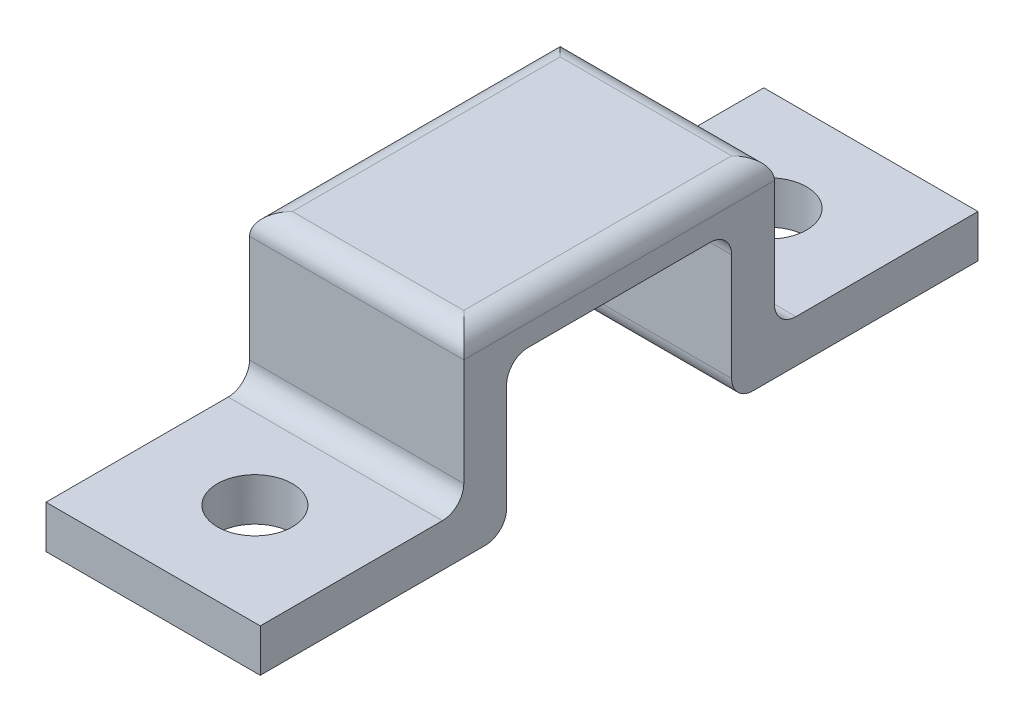
ISO-10303-21;
HEADER;
FILE_DESCRIPTION(('STEP AP214'),'2;1');
FILE_NAME('part.step','',(''),(''),'','','');
FILE_SCHEMA(('AUTOMOTIVE_DESIGN { 1 0 10303 214 1 1 1 1 }'));
ENDSEC;
DATA;
#1=APPLICATION_CONTEXT('core data for automotive mechanical design processes');
#2=APPLICATION_PROTOCOL_DEFINITION('international standard','automotive_design',2000,#1);
#3=PRODUCT_CONTEXT('',#1,'mechanical');
#4=PRODUCT('Part','Part','',(#3));
#5=PRODUCT_RELATED_PRODUCT_CATEGORY('part','',(#4));
#6=PRODUCT_DEFINITION_FORMATION('','',#4);
#7=PRODUCT_DEFINITION_CONTEXT('part definition',#1,'design');
#8=PRODUCT_DEFINITION('design','',#6,#7);
#9=PRODUCT_DEFINITION_SHAPE('','',#8);
#10=(LENGTH_UNIT() NAMED_UNIT(*) SI_UNIT(.MILLI.,.METRE.));
#11=(NAMED_UNIT(*) PLANE_ANGLE_UNIT() SI_UNIT($,.RADIAN.));
#12=(NAMED_UNIT(*) SI_UNIT($,.STERADIAN.) SOLID_ANGLE_UNIT());
#13=UNCERTAINTY_MEASURE_WITH_UNIT(LENGTH_MEASURE(1.E-05),#10,'distance_accuracy_value','');
#14=(GEOMETRIC_REPRESENTATION_CONTEXT(3) GLOBAL_UNCERTAINTY_ASSIGNED_CONTEXT((#13)) GLOBAL_UNIT_ASSIGNED_CONTEXT((#10,
#11,#12)) REPRESENTATION_CONTEXT('',''));
#15=CARTESIAN_POINT('',(0.,0.,0.));
#16=DIRECTION('',(0.,0.,1.));
#17=DIRECTION('',(1.,0.,0.));
#18=AXIS2_PLACEMENT_3D('',#15,#16,#17);
#19=CARTESIAN_POINT('',(20.,0.,10.5));
#20=DIRECTION('',(0.,0.,1.));
#21=DIRECTION('',(1.,0.,0.));
#22=AXIS2_PLACEMENT_3D('',#19,#20,#21);
#23=PLANE('',#22);
#24=DIRECTION('',(0.,1.,0.));
#25=VECTOR('',#24,1.);
#26=CARTESIAN_POINT('',(20.,0.,10.5));
#27=LINE('',#26,#25);
#28=CARTESIAN_POINT('',(20.,-12.,10.5));
#29=VERTEX_POINT('',#28);
#30=CARTESIAN_POINT('',(20.,-2.,10.5));
#31=VERTEX_POINT('',#30);
#32=EDGE_CURVE('E249',#29,#31,#27,.T.);
#33=ORIENTED_EDGE('',*,*,#32,.F.);
#34=DIRECTION('',(-1.,0.,0.));
#35=VECTOR('',#34,1.);
#36=CARTESIAN_POINT('',(20.,-12.,10.5));
#37=LINE('',#36,#35);
#38=CARTESIAN_POINT('',(0.,-12.,10.5));
#39=VERTEX_POINT('',#38);
#40=EDGE_CURVE('E279',#29,#39,#37,.T.);
#41=ORIENTED_EDGE('',*,*,#40,.T.);
#42=DIRECTION('',(0.,1.,0.));
#43=VECTOR('',#42,1.);
#44=CARTESIAN_POINT('',(0.,0.,10.5));
#45=LINE('',#44,#43);
#46=CARTESIAN_POINT('',(0.,-2.,10.5));
#47=VERTEX_POINT('',#46);
#48=EDGE_CURVE('E221',#39,#47,#45,.T.);
#49=ORIENTED_EDGE('',*,*,#48,.T.);
#50=DIRECTION('',(-1.,0.,0.));
#51=VECTOR('',#50,1.);
#52=CARTESIAN_POINT('',(20.,-2.,10.5));
#53=LINE('',#52,#51);
#54=EDGE_CURVE('E277',#47,#31,#53,.F.);
#55=ORIENTED_EDGE('',*,*,#54,.T.);
#56=EDGE_LOOP('',(#33,#41,#49,#55));
#57=FACE_BOUND('',#56,.T.);
#58=ADVANCED_FACE('F37',(#57),#23,.F.);
#59=CARTESIAN_POINT('',(20.,0.,10.5));
#60=DIRECTION('',(0.,1.,0.));
#61=DIRECTION('',(0.,0.,1.));
#62=AXIS2_PLACEMENT_3D('',#59,#60,#61);
#63=PLANE('',#62);
#64=DIRECTION('',(0.,0.,-1.));
#65=VECTOR('',#64,1.);
#66=CARTESIAN_POINT('',(20.,0.,10.5));
#67=LINE('',#66,#65);
#68=CARTESIAN_POINT('',(20.,0.,8.5));
#69=VERTEX_POINT('',#68);
#70=CARTESIAN_POINT('',(20.,0.,-8.49999999999999));
#71=VERTEX_POINT('',#70);
#72=EDGE_CURVE('E351',#69,#71,#67,.T.);
#73=ORIENTED_EDGE('',*,*,#72,.F.);
#74=DIRECTION('',(-1.,0.,0.));
#75=VECTOR('',#74,1.);
#76=CARTESIAN_POINT('',(0.,0.,8.5));
#77=LINE('',#76,#75);
#78=CARTESIAN_POINT('',(0.,0.,8.5));
#79=VERTEX_POINT('',#78);
#80=EDGE_CURVE('E307',#69,#79,#77,.T.);
#81=ORIENTED_EDGE('',*,*,#80,.T.);
#82=DIRECTION('',(0.,0.,-1.));
#83=VECTOR('',#82,1.);
#84=CARTESIAN_POINT('',(0.,0.,10.5));
#85=LINE('',#84,#83);
#86=CARTESIAN_POINT('',(0.,0.,-8.49999999999999));
#87=VERTEX_POINT('',#86);
#88=EDGE_CURVE('E224',#79,#87,#85,.T.);
#89=ORIENTED_EDGE('',*,*,#88,.T.);
#90=DIRECTION('',(-1.,0.,0.));
#91=VECTOR('',#90,1.);
#92=CARTESIAN_POINT('',(20.,0.,-8.5));
#93=LINE('',#92,#91);
#94=EDGE_CURVE('E305',#87,#71,#93,.F.);
#95=ORIENTED_EDGE('',*,*,#94,.T.);
#96=EDGE_LOOP('',(#73,#81,#89,#95));
#97=FACE_BOUND('',#96,.T.);
#98=ADVANCED_FACE('F414',(#97),#63,.F.);
#99=CARTESIAN_POINT('',(20.,0.,-10.5));
#100=DIRECTION('',(0.,0.,-1.));
#101=DIRECTION('',(-1.,0.,0.));
#102=AXIS2_PLACEMENT_3D('',#99,#100,#101);
#103=PLANE('',#102);
#104=DIRECTION('',(0.,-1.,0.));
#105=VECTOR('',#104,1.);
#106=CARTESIAN_POINT('',(0.,0.,-10.5));
#107=LINE('',#106,#105);
#108=CARTESIAN_POINT('',(0.,-2.,-10.5));
#109=VERTEX_POINT('',#108);
#110=CARTESIAN_POINT('',(0.,-12.,-10.5));
#111=VERTEX_POINT('',#110);
#112=EDGE_CURVE('E227',#109,#111,#107,.T.);
#113=ORIENTED_EDGE('',*,*,#112,.T.);
#114=DIRECTION('',(-1.,0.,0.));
#115=VECTOR('',#114,1.);
#116=CARTESIAN_POINT('',(20.,-12.,-10.5));
#117=LINE('',#116,#115);
#118=CARTESIAN_POINT('',(20.,-12.,-10.5));
#119=VERTEX_POINT('',#118);
#120=EDGE_CURVE('E289',#111,#119,#117,.F.);
#121=ORIENTED_EDGE('',*,*,#120,.T.);
#122=DIRECTION('',(0.,-1.,0.));
#123=VECTOR('',#122,1.);
#124=CARTESIAN_POINT('',(20.,0.,-10.5));
#125=LINE('',#124,#123);
#126=CARTESIAN_POINT('',(20.,-2.,-10.5));
#127=VERTEX_POINT('',#126);
#128=EDGE_CURVE('E189',#127,#119,#125,.T.);
#129=ORIENTED_EDGE('',*,*,#128,.F.);
#130=DIRECTION('',(-1.,0.,0.));
#131=VECTOR('',#130,1.);
#132=CARTESIAN_POINT('',(0.,-2.,-10.5));
#133=LINE('',#132,#131);
#134=EDGE_CURVE('E286',#127,#109,#133,.T.);
#135=ORIENTED_EDGE('',*,*,#134,.T.);
#136=EDGE_LOOP('',(#113,#121,#129,#135));
#137=FACE_BOUND('',#136,.T.);
#138=ADVANCED_FACE('F416',(#137),#103,.F.);
#139=CARTESIAN_POINT('',(20.,-14.,-10.5));
#140=DIRECTION('',(0.,1.,0.));
#141=DIRECTION('',(0.,0.,1.));
#142=AXIS2_PLACEMENT_3D('',#139,#140,#141);
#143=PLANE('',#142);
#144=CARTESIAN_POINT('',(10.,-14.,-24.));
#145=DIRECTION('',(0.,1.,0.));
#146=DIRECTION('',(0.,0.,1.));
#147=AXIS2_PLACEMENT_3D('',#144,#145,#146);
#148=CIRCLE('',#147,3.5);
#149=CARTESIAN_POINT('',(10.,-14.,-20.5));
#150=VERTEX_POINT('',#149);
#151=EDGE_CURVE('E225',#150,#150,#148,.F.);
#152=ORIENTED_EDGE('',*,*,#151,.F.);
#153=EDGE_LOOP('',(#152));
#154=FACE_BOUND('',#153,.T.);
#155=DIRECTION('',(0.,0.,-1.));
#156=VECTOR('',#155,1.);
#157=CARTESIAN_POINT('',(20.,-14.,-10.5));
#158=LINE('',#157,#156);
#159=CARTESIAN_POINT('',(20.,-14.,-12.5));
#160=VERTEX_POINT('',#159);
#161=CARTESIAN_POINT('',(20.,-14.,-33.5));
#162=VERTEX_POINT('',#161);
#163=EDGE_CURVE('E175',#160,#162,#158,.T.);
#164=ORIENTED_EDGE('',*,*,#163,.F.);
#165=DIRECTION('',(-1.,0.,0.));
#166=VECTOR('',#165,1.);
#167=CARTESIAN_POINT('',(20.,-14.,-12.5));
#168=LINE('',#167,#166);
#169=CARTESIAN_POINT('',(0.,-14.,-12.5));
#170=VERTEX_POINT('',#169);
#171=EDGE_CURVE('E284',#160,#170,#168,.T.);
#172=ORIENTED_EDGE('',*,*,#171,.T.);
#173=DIRECTION('',(0.,0.,-1.));
#174=VECTOR('',#173,1.);
#175=CARTESIAN_POINT('',(0.,-14.,-10.5));
#176=LINE('',#175,#174);
#177=CARTESIAN_POINT('',(0.,-14.,-33.5));
#178=VERTEX_POINT('',#177);
#179=EDGE_CURVE('E195',#170,#178,#176,.T.);
#180=ORIENTED_EDGE('',*,*,#179,.T.);
#181=DIRECTION('',(-1.,0.,0.));
#182=VECTOR('',#181,1.);
#183=CARTESIAN_POINT('',(20.,-14.,-33.5));
#184=LINE('',#183,#182);
#185=EDGE_CURVE('E192',#162,#178,#184,.T.);
#186=ORIENTED_EDGE('',*,*,#185,.F.);
#187=EDGE_LOOP('',(#164,#172,#180,#186));
#188=FACE_BOUND('',#187,.T.);
#189=ADVANCED_FACE('F193',(#154,#188),#143,.F.);
#190=CARTESIAN_POINT('',(20.,-14.,-33.5));
#191=DIRECTION('',(0.,0.,1.));
#192=DIRECTION('',(1.,0.,0.));
#193=AXIS2_PLACEMENT_3D('',#190,#191,#192);
#194=PLANE('',#193);
#195=DIRECTION('',(0.,1.,0.));
#196=VECTOR('',#195,1.);
#197=CARTESIAN_POINT('',(0.,-14.,-33.5));
#198=LINE('',#197,#196);
#199=CARTESIAN_POINT('',(0.,-10.,-33.5));
#200=VERTEX_POINT('',#199);
#201=EDGE_CURVE('E231',#178,#200,#198,.T.);
#202=ORIENTED_EDGE('',*,*,#201,.T.);
#203=DIRECTION('',(-1.,0.,0.));
#204=VECTOR('',#203,1.);
#205=CARTESIAN_POINT('',(20.,-10.,-33.5));
#206=LINE('',#205,#204);
#207=CARTESIAN_POINT('',(20.,-10.,-33.5));
#208=VERTEX_POINT('',#207);
#209=EDGE_CURVE('E198',#208,#200,#206,.T.);
#210=ORIENTED_EDGE('',*,*,#209,.F.);
#211=DIRECTION('',(0.,1.,0.));
#212=VECTOR('',#211,1.);
#213=CARTESIAN_POINT('',(20.,-14.,-33.5));
#214=LINE('',#213,#212);
#215=EDGE_CURVE('E181',#162,#208,#214,.T.);
#216=ORIENTED_EDGE('',*,*,#215,.F.);
#217=ORIENTED_EDGE('',*,*,#185,.T.);
#218=EDGE_LOOP('',(#202,#210,#216,#217));
#219=FACE_BOUND('',#218,.T.);
#220=ADVANCED_FACE('F200',(#219),#194,.F.);
#221=CARTESIAN_POINT('',(20.,-10.,-33.5));
#222=DIRECTION('',(0.,-1.,0.));
#223=DIRECTION('',(0.,0.,-1.));
#224=AXIS2_PLACEMENT_3D('',#221,#222,#223);
#225=PLANE('',#224);
#226=CARTESIAN_POINT('',(10.,-10.,-24.));
#227=DIRECTION('',(0.,1.,0.));
#228=DIRECTION('',(0.,0.,1.));
#229=AXIS2_PLACEMENT_3D('',#226,#227,#228);
#230=CIRCLE('',#229,3.5);
#231=CARTESIAN_POINT('',(10.,-10.,-20.5));
#232=VERTEX_POINT('',#231);
#233=EDGE_CURVE('E342',#232,#232,#230,.T.);
#234=ORIENTED_EDGE('',*,*,#233,.F.);
#235=EDGE_LOOP('',(#234));
#236=FACE_BOUND('',#235,.T.);
#237=DIRECTION('',(0.,0.,1.));
#238=VECTOR('',#237,1.);
#239=CARTESIAN_POINT('',(0.,-10.,-33.5));
#240=LINE('',#239,#238);
#241=CARTESIAN_POINT('',(0.,-10.,-16.5));
#242=VERTEX_POINT('',#241);
#243=EDGE_CURVE('E233',#200,#242,#240,.T.);
#244=ORIENTED_EDGE('',*,*,#243,.T.);
#245=DIRECTION('',(-1.,0.,0.));
#246=VECTOR('',#245,1.);
#247=CARTESIAN_POINT('',(20.,-10.,-16.5));
#248=LINE('',#247,#246);
#249=CARTESIAN_POINT('',(20.,-10.,-16.5));
#250=VERTEX_POINT('',#249);
#251=EDGE_CURVE('E296',#242,#250,#248,.F.);
#252=ORIENTED_EDGE('',*,*,#251,.T.);
#253=DIRECTION('',(0.,0.,1.));
#254=VECTOR('',#253,1.);
#255=CARTESIAN_POINT('',(20.,-10.,-33.5));
#256=LINE('',#255,#254);
#257=EDGE_CURVE('E203',#208,#250,#256,.T.);
#258=ORIENTED_EDGE('',*,*,#257,.F.);
#259=ORIENTED_EDGE('',*,*,#209,.T.);
#260=EDGE_LOOP('',(#244,#252,#258,#259));
#261=FACE_BOUND('',#260,.T.);
#262=ADVANCED_FACE('F364',(#236,#261),#225,.F.);
#263=CARTESIAN_POINT('',(20.,-10.,-14.5));
#264=DIRECTION('',(0.,0.,1.));
#265=DIRECTION('',(0.,-1.,0.));
#266=AXIS2_PLACEMENT_3D('',#263,#264,#265);
#267=PLANE('',#266);
#268=DIRECTION('',(0.,1.,0.));
#269=VECTOR('',#268,1.);
#270=CARTESIAN_POINT('',(20.,-10.,-14.5));
#271=LINE('',#270,#269);
#272=CARTESIAN_POINT('',(20.,-8.,-14.5));
#273=VERTEX_POINT('',#272);
#274=CARTESIAN_POINT('',(20.,2.,-14.5));
#275=VERTEX_POINT('',#274);
#276=EDGE_CURVE('E205',#273,#275,#271,.T.);
#277=ORIENTED_EDGE('',*,*,#276,.F.);
#278=DIRECTION('',(-1.,0.,0.));
#279=VECTOR('',#278,1.);
#280=CARTESIAN_POINT('',(0.,-8.,-14.5));
#281=LINE('',#280,#279);
#282=CARTESIAN_POINT('',(0.,-8.,-14.5));
#283=VERTEX_POINT('',#282);
#284=EDGE_CURVE('E293',#273,#283,#281,.T.);
#285=ORIENTED_EDGE('',*,*,#284,.T.);
#286=DIRECTION('',(0.,1.,0.));
#287=VECTOR('',#286,1.);
#288=CARTESIAN_POINT('',(0.,-10.,-14.5));
#289=LINE('',#288,#287);
#290=CARTESIAN_POINT('',(0.,2.,-14.5));
#291=VERTEX_POINT('',#290);
#292=EDGE_CURVE('E236',#283,#291,#289,.T.);
#293=ORIENTED_EDGE('',*,*,#292,.T.);
#294=DIRECTION('',(-1.,0.,0.));
#295=VECTOR('',#294,1.);
#296=CARTESIAN_POINT('',(20.,2.,-14.5));
#297=LINE('',#296,#295);
#298=EDGE_CURVE('E291',#291,#275,#297,.F.);
#299=ORIENTED_EDGE('',*,*,#298,.T.);
#300=EDGE_LOOP('',(#277,#285,#293,#299));
#301=FACE_BOUND('',#300,.T.);
#302=ADVANCED_FACE('F373',(#301),#267,.F.);
#303=CARTESIAN_POINT('',(20.,4.,-14.5));
#304=DIRECTION('',(0.,-1.,0.));
#305=DIRECTION('',(0.,0.,-1.));
#306=AXIS2_PLACEMENT_3D('',#303,#304,#305);
#307=PLANE('',#306);
#308=DIRECTION('',(0.,0.,1.));
#309=VECTOR('',#308,1.);
#310=CARTESIAN_POINT('',(2.,4.,14.5));
#311=LINE('',#310,#309);
#312=CARTESIAN_POINT('',(2.,4.,-12.5));
#313=VERTEX_POINT('',#312);
#314=CARTESIAN_POINT('',(2.,4.,12.5));
#315=VERTEX_POINT('',#314);
#316=EDGE_CURVE('E264',#313,#315,#311,.T.);
#317=ORIENTED_EDGE('',*,*,#316,.T.);
#318=DIRECTION('',(-1.,0.,0.));
#319=VECTOR('',#318,1.);
#320=CARTESIAN_POINT('',(20.,4.,12.5));
#321=LINE('',#320,#319);
#322=CARTESIAN_POINT('',(18.,4.,12.5));
#323=VERTEX_POINT('',#322);
#324=EDGE_CURVE('E269',#315,#323,#321,.F.);
#325=ORIENTED_EDGE('',*,*,#324,.T.);
#326=DIRECTION('',(0.,0.,1.));
#327=VECTOR('',#326,1.);
#328=CARTESIAN_POINT('',(18.,4.,-14.5));
#329=LINE('',#328,#327);
#330=CARTESIAN_POINT('',(18.,4.,-12.5));
#331=VERTEX_POINT('',#330);
#332=EDGE_CURVE('E266',#323,#331,#329,.F.);
#333=ORIENTED_EDGE('',*,*,#332,.T.);
#334=DIRECTION('',(-1.,0.,0.));
#335=VECTOR('',#334,1.);
#336=CARTESIAN_POINT('',(20.,4.,-12.5));
#337=LINE('',#336,#335);
#338=EDGE_CURVE('E262',#331,#313,#337,.T.);
#339=ORIENTED_EDGE('',*,*,#338,.T.);
#340=EDGE_LOOP('',(#317,#325,#333,#339));
#341=FACE_BOUND('',#340,.T.);
#342=ADVANCED_FACE('F573',(#341),#307,.F.);
#343=CARTESIAN_POINT('',(20.,-10.,14.5));
#344=DIRECTION('',(0.,0.,-1.));
#345=DIRECTION('',(0.,1.,0.));
#346=AXIS2_PLACEMENT_3D('',#343,#344,#345);
#347=PLANE('',#346);
#348=DIRECTION('',(0.,-1.,0.));
#349=VECTOR('',#348,1.);
#350=CARTESIAN_POINT('',(0.,-10.,14.5));
#351=LINE('',#350,#349);
#352=CARTESIAN_POINT('',(0.,2.,14.5));
#353=VERTEX_POINT('',#352);
#354=CARTESIAN_POINT('',(0.,-8.,14.5));
#355=VERTEX_POINT('',#354);
#356=EDGE_CURVE('E239',#353,#355,#351,.T.);
#357=ORIENTED_EDGE('',*,*,#356,.T.);
#358=DIRECTION('',(-1.,0.,0.));
#359=VECTOR('',#358,1.);
#360=CARTESIAN_POINT('',(20.,-8.,14.5));
#361=LINE('',#360,#359);
#362=CARTESIAN_POINT('',(20.,-8.,14.5));
#363=VERTEX_POINT('',#362);
#364=EDGE_CURVE('E303',#355,#363,#361,.F.);
#365=ORIENTED_EDGE('',*,*,#364,.T.);
#366=DIRECTION('',(0.,-1.,0.));
#367=VECTOR('',#366,1.);
#368=CARTESIAN_POINT('',(20.,-10.,14.5));
#369=LINE('',#368,#367);
#370=CARTESIAN_POINT('',(20.,2.,14.5));
#371=VERTEX_POINT('',#370);
#372=EDGE_CURVE('E210',#371,#363,#369,.T.);
#373=ORIENTED_EDGE('',*,*,#372,.F.);
#374=DIRECTION('',(-1.,0.,0.));
#375=VECTOR('',#374,1.);
#376=CARTESIAN_POINT('',(20.,2.,14.5));
#377=LINE('',#376,#375);
#378=EDGE_CURVE('E301',#371,#353,#377,.T.);
#379=ORIENTED_EDGE('',*,*,#378,.T.);
#380=EDGE_LOOP('',(#357,#365,#373,#379));
#381=FACE_BOUND('',#380,.T.);
#382=ADVANCED_FACE('F385',(#381),#347,.F.);
#383=CARTESIAN_POINT('',(20.,-10.,33.5));
#384=DIRECTION('',(0.,-1.,0.));
#385=DIRECTION('',(0.,0.,-1.));
#386=AXIS2_PLACEMENT_3D('',#383,#384,#385);
#387=PLANE('',#386);
#388=CARTESIAN_POINT('',(10.,-10.,24.));
#389=DIRECTION('',(0.,-1.,0.));
#390=DIRECTION('',(0.,0.,-1.));
#391=AXIS2_PLACEMENT_3D('',#388,#389,#390);
#392=CIRCLE('',#391,3.5);
#393=CARTESIAN_POINT('',(10.,-10.,20.5));
#394=VERTEX_POINT('',#393);
#395=EDGE_CURVE('E331',#394,#394,#392,.T.);
#396=ORIENTED_EDGE('',*,*,#395,.T.);
#397=EDGE_LOOP('',(#396));
#398=FACE_BOUND('',#397,.T.);
#399=DIRECTION('',(0.,0.,1.));
#400=VECTOR('',#399,1.);
#401=CARTESIAN_POINT('',(20.,-10.,33.5));
#402=LINE('',#401,#400);
#403=CARTESIAN_POINT('',(20.,-10.,16.5));
#404=VERTEX_POINT('',#403);
#405=CARTESIAN_POINT('',(20.,-10.,33.5));
#406=VERTEX_POINT('',#405);
#407=EDGE_CURVE('E213',#404,#406,#402,.T.);
#408=ORIENTED_EDGE('',*,*,#407,.F.);
#409=DIRECTION('',(-1.,0.,0.));
#410=VECTOR('',#409,1.);
#411=CARTESIAN_POINT('',(0.,-10.,16.5));
#412=LINE('',#411,#410);
#413=CARTESIAN_POINT('',(0.,-10.,16.5));
#414=VERTEX_POINT('',#413);
#415=EDGE_CURVE('E298',#404,#414,#412,.T.);
#416=ORIENTED_EDGE('',*,*,#415,.T.);
#417=DIRECTION('',(0.,0.,1.));
#418=VECTOR('',#417,1.);
#419=CARTESIAN_POINT('',(0.,-10.,33.5));
#420=LINE('',#419,#418);
#421=CARTESIAN_POINT('',(0.,-10.,33.5));
#422=VERTEX_POINT('',#421);
#423=EDGE_CURVE('E242',#414,#422,#420,.T.);
#424=ORIENTED_EDGE('',*,*,#423,.T.);
#425=DIRECTION('',(-1.,0.,0.));
#426=VECTOR('',#425,1.);
#427=CARTESIAN_POINT('',(20.,-10.,33.5));
#428=LINE('',#427,#426);
#429=EDGE_CURVE('E252',#406,#422,#428,.T.);
#430=ORIENTED_EDGE('',*,*,#429,.F.);
#431=EDGE_LOOP('',(#408,#416,#424,#430));
#432=FACE_BOUND('',#431,.T.);
#433=ADVANCED_FACE('F393',(#398,#432),#387,.F.);
#434=CARTESIAN_POINT('',(20.,-14.,33.5));
#435=DIRECTION('',(0.,0.,-1.));
#436=DIRECTION('',(-1.,0.,0.));
#437=AXIS2_PLACEMENT_3D('',#434,#435,#436);
#438=PLANE('',#437);
#439=DIRECTION('',(0.,-1.,0.));
#440=VECTOR('',#439,1.);
#441=CARTESIAN_POINT('',(0.,-14.,33.5));
#442=LINE('',#441,#440);
#443=CARTESIAN_POINT('',(0.,-14.,33.5));
#444=VERTEX_POINT('',#443);
#445=EDGE_CURVE('E244',#422,#444,#442,.T.);
#446=ORIENTED_EDGE('',*,*,#445,.T.);
#447=DIRECTION('',(-1.,0.,0.));
#448=VECTOR('',#447,1.);
#449=CARTESIAN_POINT('',(20.,-14.,33.5));
#450=LINE('',#449,#448);
#451=CARTESIAN_POINT('',(20.,-14.,33.5));
#452=VERTEX_POINT('',#451);
#453=EDGE_CURVE('E220',#452,#444,#450,.T.);
#454=ORIENTED_EDGE('',*,*,#453,.F.);
#455=DIRECTION('',(0.,-1.,0.));
#456=VECTOR('',#455,1.);
#457=CARTESIAN_POINT('',(20.,-14.,33.5));
#458=LINE('',#457,#456);
#459=EDGE_CURVE('E215',#406,#452,#458,.T.);
#460=ORIENTED_EDGE('',*,*,#459,.F.);
#461=ORIENTED_EDGE('',*,*,#429,.T.);
#462=EDGE_LOOP('',(#446,#454,#460,#461));
#463=FACE_BOUND('',#462,.T.);
#464=ADVANCED_FACE('F399',(#463),#438,.F.);
#465=CARTESIAN_POINT('',(20.,-14.,10.5));
#466=DIRECTION('',(0.,1.,0.));
#467=DIRECTION('',(0.,0.,1.));
#468=AXIS2_PLACEMENT_3D('',#465,#466,#467);
#469=PLANE('',#468);
#470=CARTESIAN_POINT('',(10.,-14.,24.));
#471=DIRECTION('',(0.,1.,0.));
#472=DIRECTION('',(0.,0.,1.));
#473=AXIS2_PLACEMENT_3D('',#470,#471,#472);
#474=CIRCLE('',#473,3.5);
#475=CARTESIAN_POINT('',(10.,-14.,27.5));
#476=VERTEX_POINT('',#475);
#477=EDGE_CURVE('E337',#476,#476,#474,.T.);
#478=ORIENTED_EDGE('',*,*,#477,.T.);
#479=EDGE_LOOP('',(#478));
#480=FACE_BOUND('',#479,.T.);
#481=DIRECTION('',(0.,0.,-1.));
#482=VECTOR('',#481,1.);
#483=CARTESIAN_POINT('',(0.,-14.,10.5));
#484=LINE('',#483,#482);
#485=CARTESIAN_POINT('',(0.,-14.,12.5));
#486=VERTEX_POINT('',#485);
#487=EDGE_CURVE('E246',#444,#486,#484,.T.);
#488=ORIENTED_EDGE('',*,*,#487,.T.);
#489=DIRECTION('',(-1.,0.,0.));
#490=VECTOR('',#489,1.);
#491=CARTESIAN_POINT('',(20.,-14.,12.5));
#492=LINE('',#491,#490);
#493=CARTESIAN_POINT('',(20.,-14.,12.5));
#494=VERTEX_POINT('',#493);
#495=EDGE_CURVE('E282',#486,#494,#492,.F.);
#496=ORIENTED_EDGE('',*,*,#495,.T.);
#497=DIRECTION('',(0.,0.,-1.));
#498=VECTOR('',#497,1.);
#499=CARTESIAN_POINT('',(20.,-14.,10.5));
#500=LINE('',#499,#498);
#501=EDGE_CURVE('E217',#452,#494,#500,.T.);
#502=ORIENTED_EDGE('',*,*,#501,.F.);
#503=ORIENTED_EDGE('',*,*,#453,.T.);
#504=EDGE_LOOP('',(#488,#496,#502,#503));
#505=FACE_BOUND('',#504,.T.);
#506=ADVANCED_FACE('F542',(#480,#505),#469,.F.);
#507=CARTESIAN_POINT('',(20.,0.,0.));
#508=DIRECTION('',(-1.,0.,0.));
#509=DIRECTION('',(0.,0.,1.));
#510=AXIS2_PLACEMENT_3D('',#507,#508,#509);
#511=PLANE('',#510);
#512=ORIENTED_EDGE('',*,*,#276,.T.);
#513=DIRECTION('',(0.,0.,1.));
#514=VECTOR('',#513,1.);
#515=CARTESIAN_POINT('',(20.,2.,0.));
#516=LINE('',#515,#514);
#517=EDGE_CURVE('E259',#275,#371,#516,.T.);
#518=ORIENTED_EDGE('',*,*,#517,.T.);
#519=ORIENTED_EDGE('',*,*,#372,.T.);
#520=CARTESIAN_POINT('',(20.,-8.,16.5));
#521=DIRECTION('',(-1.,0.,0.));
#522=DIRECTION('',(0.,0.,1.));
#523=AXIS2_PLACEMENT_3D('',#520,#521,#522);
#524=CIRCLE('',#523,2.);
#525=EDGE_CURVE('E315',#363,#404,#524,.T.);
#526=ORIENTED_EDGE('',*,*,#525,.T.);
#527=ORIENTED_EDGE('',*,*,#407,.T.);
#528=ORIENTED_EDGE('',*,*,#459,.T.);
#529=ORIENTED_EDGE('',*,*,#501,.T.);
#530=CARTESIAN_POINT('',(20.,-12.,12.5));
#531=DIRECTION('',(-1.,0.,0.));
#532=DIRECTION('',(0.,0.,1.));
#533=AXIS2_PLACEMENT_3D('',#530,#531,#532);
#534=CIRCLE('',#533,2.);
#535=EDGE_CURVE('E257',#494,#29,#534,.F.);
#536=ORIENTED_EDGE('',*,*,#535,.T.);
#537=ORIENTED_EDGE('',*,*,#32,.T.);
#538=CARTESIAN_POINT('',(20.,-2.,8.5));
#539=DIRECTION('',(-1.,0.,0.));
#540=DIRECTION('',(0.,0.,1.));
#541=AXIS2_PLACEMENT_3D('',#538,#539,#540);
#542=CIRCLE('',#541,2.);
#543=EDGE_CURVE('E318',#31,#69,#542,.T.);
#544=ORIENTED_EDGE('',*,*,#543,.T.);
#545=ORIENTED_EDGE('',*,*,#72,.T.);
#546=CARTESIAN_POINT('',(20.,-2.,-8.5));
#547=DIRECTION('',(-1.,0.,0.));
#548=DIRECTION('',(0.,0.,1.));
#549=AXIS2_PLACEMENT_3D('',#546,#547,#548);
#550=CIRCLE('',#549,2.);
#551=EDGE_CURVE('E11',#71,#127,#550,.T.);
#552=ORIENTED_EDGE('',*,*,#551,.T.);
#553=ORIENTED_EDGE('',*,*,#128,.T.);
#554=CARTESIAN_POINT('',(20.,-12.,-12.5));
#555=DIRECTION('',(-1.,0.,0.));
#556=DIRECTION('',(0.,0.,1.));
#557=AXIS2_PLACEMENT_3D('',#554,#555,#556);
#558=CIRCLE('',#557,2.);
#559=EDGE_CURVE('E185',#119,#160,#558,.F.);
#560=ORIENTED_EDGE('',*,*,#559,.T.);
#561=ORIENTED_EDGE('',*,*,#163,.T.);
#562=ORIENTED_EDGE('',*,*,#215,.T.);
#563=ORIENTED_EDGE('',*,*,#257,.T.);
#564=CARTESIAN_POINT('',(20.,-8.,-16.5));
#565=DIRECTION('',(-1.,0.,0.));
#566=DIRECTION('',(0.,0.,1.));
#567=AXIS2_PLACEMENT_3D('',#564,#565,#566);
#568=CIRCLE('',#567,2.);
#569=EDGE_CURVE('E311',#250,#273,#568,.T.);
#570=ORIENTED_EDGE('',*,*,#569,.T.);
#571=EDGE_LOOP('',(#512,#518,#519,#526,#527,#528,#529,#536,#537,#544,#545,#552,#553,#560,#561,
#562,#563,#570));
#572=FACE_BOUND('',#571,.T.);
#573=ADVANCED_FACE('F178',(#572),#511,.F.);
#574=CARTESIAN_POINT('',(0.,0.,0.));
#575=DIRECTION('',(-1.,0.,0.));
#576=DIRECTION('',(0.,0.,1.));
#577=AXIS2_PLACEMENT_3D('',#574,#575,#576);
#578=PLANE('',#577);
#579=ORIENTED_EDGE('',*,*,#356,.F.);
#580=DIRECTION('',(0.,0.,1.));
#581=VECTOR('',#580,1.);
#582=CARTESIAN_POINT('',(0.,2.,-14.5));
#583=LINE('',#582,#581);
#584=EDGE_CURVE('E275',#353,#291,#583,.F.);
#585=ORIENTED_EDGE('',*,*,#584,.T.);
#586=ORIENTED_EDGE('',*,*,#292,.F.);
#587=CARTESIAN_POINT('',(0.,-8.,-16.5));
#588=DIRECTION('',(-1.,0.,0.));
#589=DIRECTION('',(0.,0.,1.));
#590=AXIS2_PLACEMENT_3D('',#587,#588,#589);
#591=CIRCLE('',#590,2.);
#592=EDGE_CURVE('E309',#283,#242,#591,.F.);
#593=ORIENTED_EDGE('',*,*,#592,.T.);
#594=ORIENTED_EDGE('',*,*,#243,.F.);
#595=ORIENTED_EDGE('',*,*,#201,.F.);
#596=ORIENTED_EDGE('',*,*,#179,.F.);
#597=CARTESIAN_POINT('',(0.,-12.,-12.5));
#598=DIRECTION('',(-1.,0.,0.));
#599=DIRECTION('',(0.,0.,1.));
#600=AXIS2_PLACEMENT_3D('',#597,#598,#599);
#601=CIRCLE('',#600,2.);
#602=EDGE_CURVE('E271',#170,#111,#601,.T.);
#603=ORIENTED_EDGE('',*,*,#602,.T.);
#604=ORIENTED_EDGE('',*,*,#112,.F.);
#605=CARTESIAN_POINT('',(0.,-2.,-8.5));
#606=DIRECTION('',(-1.,0.,0.));
#607=DIRECTION('',(0.,0.,1.));
#608=AXIS2_PLACEMENT_3D('',#605,#606,#607);
#609=CIRCLE('',#608,2.);
#610=EDGE_CURVE('E46',#109,#87,#609,.F.);
#611=ORIENTED_EDGE('',*,*,#610,.T.);
#612=ORIENTED_EDGE('',*,*,#88,.F.);
#613=CARTESIAN_POINT('',(0.,-2.,8.5));
#614=DIRECTION('',(-1.,0.,0.));
#615=DIRECTION('',(0.,0.,1.));
#616=AXIS2_PLACEMENT_3D('',#613,#614,#615);
#617=CIRCLE('',#616,2.);
#618=EDGE_CURVE('E61',#79,#47,#617,.F.);
#619=ORIENTED_EDGE('',*,*,#618,.T.);
#620=ORIENTED_EDGE('',*,*,#48,.F.);
#621=CARTESIAN_POINT('',(0.,-12.,12.5));
#622=DIRECTION('',(-1.,0.,0.));
#623=DIRECTION('',(0.,0.,1.));
#624=AXIS2_PLACEMENT_3D('',#621,#622,#623);
#625=CIRCLE('',#624,2.);
#626=EDGE_CURVE('E273',#39,#486,#625,.T.);
#627=ORIENTED_EDGE('',*,*,#626,.T.);
#628=ORIENTED_EDGE('',*,*,#487,.F.);
#629=ORIENTED_EDGE('',*,*,#445,.F.);
#630=ORIENTED_EDGE('',*,*,#423,.F.);
#631=CARTESIAN_POINT('',(0.,-8.,16.5));
#632=DIRECTION('',(-1.,0.,0.));
#633=DIRECTION('',(0.,0.,1.));
#634=AXIS2_PLACEMENT_3D('',#631,#632,#633);
#635=CIRCLE('',#634,2.);
#636=EDGE_CURVE('E313',#414,#355,#635,.F.);
#637=ORIENTED_EDGE('',*,*,#636,.T.);
#638=EDGE_LOOP('',(#579,#585,#586,#593,#594,#595,#596,#603,#604,#611,#612,#619,#620,#627,#628,
#629,#630,#637));
#639=FACE_BOUND('',#638,.T.);
#640=ADVANCED_FACE('F361',(#639),#578,.T.);
#641=CARTESIAN_POINT('',(10.,-23.8994949366117,-24.));
#642=DIRECTION('',(0.,1.,0.));
#643=DIRECTION('',(0.,0.,1.));
#644=AXIS2_PLACEMENT_3D('',#641,#642,#643);
#645=CYLINDRICAL_SURFACE('',#644,3.5);
#646=CARTESIAN_POINT('',(10.,-14.,-20.5));
#647=CARTESIAN_POINT('',(10.,-13.9583333333333,-20.5));
#648=CARTESIAN_POINT('',(10.,-13.9166666666667,-20.5));
#649=CARTESIAN_POINT('',(10.,-13.8333333333333,-20.5));
#650=CARTESIAN_POINT('',(10.,-13.7916666666667,-20.5));
#651=CARTESIAN_POINT('',(10.,-13.7083333333333,-20.5));
#652=CARTESIAN_POINT('',(10.,-13.6666666666667,-20.5));
#653=CARTESIAN_POINT('',(10.,-13.5833333333333,-20.5));
#654=CARTESIAN_POINT('',(10.,-13.5416666666667,-20.5));
#655=CARTESIAN_POINT('',(10.,-13.4583333333333,-20.5));
#656=CARTESIAN_POINT('',(10.,-13.4166666666667,-20.5));
#657=CARTESIAN_POINT('',(10.,-13.3333333333333,-20.5));
#658=CARTESIAN_POINT('',(10.,-13.2916666666667,-20.5));
#659=CARTESIAN_POINT('',(10.,-13.2083333333333,-20.5));
#660=CARTESIAN_POINT('',(10.,-13.1666666666667,-20.5));
#661=CARTESIAN_POINT('',(10.,-13.0833333333333,-20.5));
#662=CARTESIAN_POINT('',(10.,-13.0416666666667,-20.5));
#663=CARTESIAN_POINT('',(10.,-12.9583333333333,-20.5));
#664=CARTESIAN_POINT('',(10.,-12.9166666666667,-20.5));
#665=CARTESIAN_POINT('',(10.,-12.8333333333333,-20.5));
#666=CARTESIAN_POINT('',(10.,-12.7916666666667,-20.5));
#667=CARTESIAN_POINT('',(10.,-12.7083333333333,-20.5));
#668=CARTESIAN_POINT('',(10.,-12.6666666666667,-20.5));
#669=CARTESIAN_POINT('',(10.,-12.5833333333333,-20.5));
#670=CARTESIAN_POINT('',(10.,-12.5416666666667,-20.5));
#671=CARTESIAN_POINT('',(10.,-12.4583333333333,-20.5));
#672=CARTESIAN_POINT('',(10.,-12.4166666666667,-20.5));
#673=CARTESIAN_POINT('',(10.,-12.3333333333333,-20.5));
#674=CARTESIAN_POINT('',(10.,-12.2916666666667,-20.5));
#675=CARTESIAN_POINT('',(10.,-12.2083333333333,-20.5));
#676=CARTESIAN_POINT('',(10.,-12.1666666666667,-20.5));
#677=CARTESIAN_POINT('',(10.,-12.0833333333333,-20.5));
#678=CARTESIAN_POINT('',(10.,-12.0416666666667,-20.5));
#679=CARTESIAN_POINT('',(10.,-11.9583333333333,-20.5));
#680=CARTESIAN_POINT('',(10.,-11.9166666666667,-20.5));
#681=CARTESIAN_POINT('',(10.,-11.8333333333333,-20.5));
#682=CARTESIAN_POINT('',(10.,-11.7916666666667,-20.5));
#683=CARTESIAN_POINT('',(10.,-11.7083333333333,-20.5));
#684=CARTESIAN_POINT('',(10.,-11.6666666666667,-20.5));
#685=CARTESIAN_POINT('',(10.,-11.5833333333333,-20.5));
#686=CARTESIAN_POINT('',(10.,-11.5416666666667,-20.5));
#687=CARTESIAN_POINT('',(10.,-11.4583333333333,-20.5));
#688=CARTESIAN_POINT('',(10.,-11.4166666666667,-20.5));
#689=CARTESIAN_POINT('',(10.,-11.3333333333333,-20.5));
#690=CARTESIAN_POINT('',(10.,-11.2916666666667,-20.5));
#691=CARTESIAN_POINT('',(10.,-11.2083333333333,-20.5));
#692=CARTESIAN_POINT('',(10.,-11.1666666666667,-20.5));
#693=CARTESIAN_POINT('',(10.,-11.0833333333333,-20.5));
#694=CARTESIAN_POINT('',(10.,-11.0416666666667,-20.5));
#695=CARTESIAN_POINT('',(10.,-10.9583333333333,-20.5));
#696=CARTESIAN_POINT('',(10.,-10.9166666666667,-20.5));
#697=CARTESIAN_POINT('',(10.,-10.8333333333333,-20.5));
#698=CARTESIAN_POINT('',(10.,-10.7916666666667,-20.5));
#699=CARTESIAN_POINT('',(10.,-10.7083333333333,-20.5));
#700=CARTESIAN_POINT('',(10.,-10.6666666666667,-20.5));
#701=CARTESIAN_POINT('',(10.,-10.5833333333333,-20.5));
#702=CARTESIAN_POINT('',(10.,-10.5416666666667,-20.5));
#703=CARTESIAN_POINT('',(10.,-10.4583333333333,-20.5));
#704=CARTESIAN_POINT('',(10.,-10.4166666666667,-20.5));
#705=CARTESIAN_POINT('',(10.,-10.3333333333333,-20.5));
#706=CARTESIAN_POINT('',(10.,-10.2916666666667,-20.5));
#707=CARTESIAN_POINT('',(10.,-10.2083333333333,-20.5));
#708=CARTESIAN_POINT('',(10.,-10.1666666666667,-20.5));
#709=CARTESIAN_POINT('',(10.,-10.0833333333333,-20.5));
#710=CARTESIAN_POINT('',(10.,-10.0416666666667,-20.5));
#711=CARTESIAN_POINT('',(10.,-10.,-20.5));
#712=B_SPLINE_CURVE_WITH_KNOTS('',3,(#646,#647,#648,#649,#650,#651,#652,#653,#654,#655,#656,
#657,#658,#659,#660,#661,#662,#663,#664,#665,#666,#667,#668,#669,#670,#671,#672,#673,#674,#675,
#676,#677,#678,#679,#680,#681,#682,#683,#684,#685,#686,#687,#688,#689,#690,#691,#692,#693,#694,
#695,#696,#697,#698,#699,#700,#701,#702,#703,#704,#705,#706,#707,#708,#709,#710,#711),
.UNSPECIFIED.,.F.,.F.,(4,2,2,2,2,2,2,2,2,2,2,2,2,2,2,2,2,2,2,2,2,2,2,2,2,2,2,2,2,2,2,2,4),(0.,
0.125,0.25,0.375,0.5,0.625000000000001,0.750000000000001,0.875000000000001,1.,1.125,1.25,1.375,
1.5,1.625,1.75,1.875,2.,2.125,2.25,2.375,2.5,2.625,2.75,2.875,3.,3.125,3.25,3.375,3.5,3.625,
3.75,3.875,4.),.UNSPECIFIED.);
#713=EDGE_CURVE('BSEAM530',#150,#232,#712,.T.);
#714=ORIENTED_EDGE('',*,*,#151,.T.);
#715=ORIENTED_EDGE('',*,*,#233,.T.);
#716=ORIENTED_EDGE('',*,*,#713,.T.);
#717=ORIENTED_EDGE('',*,*,#713,.F.);
#718=EDGE_LOOP('',(#714,#716,#715,#717));
#719=FACE_BOUND('',#718,.T.);
#720=ADVANCED_FACE('F530',(#719),#645,.F.);
#721=CARTESIAN_POINT('',(10.,-23.8994949366117,24.));
#722=DIRECTION('',(0.,1.,0.));
#723=DIRECTION('',(0.,0.,1.));
#724=AXIS2_PLACEMENT_3D('',#721,#722,#723);
#725=CYLINDRICAL_SURFACE('',#724,3.5);
#726=ORIENTED_EDGE('',*,*,#477,.F.);
#727=EDGE_LOOP('',(#726));
#728=FACE_BOUND('',#727,.T.);
#729=ORIENTED_EDGE('',*,*,#395,.F.);
#730=EDGE_LOOP('',(#729));
#731=FACE_BOUND('',#730,.T.);
#732=ADVANCED_FACE('F441',(#728,#731),#725,.F.);
#733=CARTESIAN_POINT('',(2.,2.,-14.5));
#734=DIRECTION('',(0.,0.,-1.));
#735=DIRECTION('',(-1.,0.,0.));
#736=AXIS2_PLACEMENT_3D('',#733,#734,#735);
#737=CYLINDRICAL_SURFACE('',#736,2.);
#738=CARTESIAN_POINT('',(2.,2.,12.5));
#739=DIRECTION('',(-0.707106781186547,0.,-0.707106781186547));
#740=DIRECTION('',(-0.707106781186547,0.,0.707106781186547));
#741=AXIS2_PLACEMENT_3D('',#738,#739,#740);
#742=ELLIPSE('',#741,2.82842712474619,2.);
#743=EDGE_CURVE('E324',#315,#353,#742,.F.);
#744=ORIENTED_EDGE('',*,*,#743,.F.);
#745=ORIENTED_EDGE('',*,*,#316,.F.);
#746=CARTESIAN_POINT('',(2.,2.,-12.5));
#747=DIRECTION('',(-0.707106781186547,0.,0.707106781186547));
#748=DIRECTION('',(-0.707106781186547,0.,-0.707106781186547));
#749=AXIS2_PLACEMENT_3D('',#746,#747,#748);
#750=ELLIPSE('',#749,2.82842712474619,2.);
#751=EDGE_CURVE('E41',#291,#313,#750,.F.);
#752=ORIENTED_EDGE('',*,*,#751,.F.);
#753=ORIENTED_EDGE('',*,*,#584,.F.);
#754=EDGE_LOOP('',(#744,#745,#752,#753));
#755=FACE_BOUND('',#754,.T.);
#756=ADVANCED_FACE('F376',(#755),#737,.T.);
#757=CARTESIAN_POINT('',(20.,2.,-12.5));
#758=DIRECTION('',(-1.,0.,0.));
#759=DIRECTION('',(0.,0.,1.));
#760=AXIS2_PLACEMENT_3D('',#757,#758,#759);
#761=CYLINDRICAL_SURFACE('',#760,2.);
#762=ORIENTED_EDGE('',*,*,#751,.T.);
#763=ORIENTED_EDGE('',*,*,#338,.F.);
#764=CARTESIAN_POINT('',(18.,2.,-12.5));
#765=DIRECTION('',(-0.707106781186547,0.,-0.707106781186547));
#766=DIRECTION('',(-0.707106781186547,0.,0.707106781186547));
#767=AXIS2_PLACEMENT_3D('',#764,#765,#766);
#768=ELLIPSE('',#767,2.82842712474619,2.);
#769=EDGE_CURVE('E323',#275,#331,#768,.F.);
#770=ORIENTED_EDGE('',*,*,#769,.F.);
#771=ORIENTED_EDGE('',*,*,#298,.F.);
#772=EDGE_LOOP('',(#762,#763,#770,#771));
#773=FACE_BOUND('',#772,.T.);
#774=ADVANCED_FACE('F379',(#773),#761,.T.);
#775=CARTESIAN_POINT('',(20.,2.,12.5));
#776=DIRECTION('',(-1.,0.,0.));
#777=DIRECTION('',(0.,0.,1.));
#778=AXIS2_PLACEMENT_3D('',#775,#776,#777);
#779=CYLINDRICAL_SURFACE('',#778,2.);
#780=ORIENTED_EDGE('',*,*,#743,.T.);
#781=ORIENTED_EDGE('',*,*,#378,.F.);
#782=CARTESIAN_POINT('',(18.,2.,12.5));
#783=DIRECTION('',(-0.707106781186547,0.,0.707106781186547));
#784=DIRECTION('',(-0.707106781186547,0.,-0.707106781186547));
#785=AXIS2_PLACEMENT_3D('',#782,#783,#784);
#786=ELLIPSE('',#785,2.82842712474619,2.);
#787=EDGE_CURVE('E321',#323,#371,#786,.F.);
#788=ORIENTED_EDGE('',*,*,#787,.F.);
#789=ORIENTED_EDGE('',*,*,#324,.F.);
#790=EDGE_LOOP('',(#780,#781,#788,#789));
#791=FACE_BOUND('',#790,.T.);
#792=ADVANCED_FACE('F434',(#791),#779,.T.);
#793=CARTESIAN_POINT('',(18.,2.,0.));
#794=DIRECTION('',(0.,0.,1.));
#795=DIRECTION('',(1.,0.,0.));
#796=AXIS2_PLACEMENT_3D('',#793,#794,#795);
#797=CYLINDRICAL_SURFACE('',#796,2.);
#798=ORIENTED_EDGE('',*,*,#769,.T.);
#799=ORIENTED_EDGE('',*,*,#332,.F.);
#800=ORIENTED_EDGE('',*,*,#787,.T.);
#801=ORIENTED_EDGE('',*,*,#517,.F.);
#802=EDGE_LOOP('',(#798,#799,#800,#801));
#803=FACE_BOUND('',#802,.T.);
#804=ADVANCED_FACE('F431',(#803),#797,.T.);
#805=CARTESIAN_POINT('',(20.,-12.,12.5));
#806=DIRECTION('',(-1.,0.,0.));
#807=DIRECTION('',(0.,0.,1.));
#808=AXIS2_PLACEMENT_3D('',#805,#806,#807);
#809=CYLINDRICAL_SURFACE('',#808,2.);
#810=ORIENTED_EDGE('',*,*,#535,.F.);
#811=ORIENTED_EDGE('',*,*,#495,.F.);
#812=ORIENTED_EDGE('',*,*,#626,.F.);
#813=ORIENTED_EDGE('',*,*,#40,.F.);
#814=EDGE_LOOP('',(#810,#811,#812,#813));
#815=FACE_BOUND('',#814,.T.);
#816=ADVANCED_FACE('F407',(#815),#809,.T.);
#817=CARTESIAN_POINT('',(20.,-12.,-12.5));
#818=DIRECTION('',(-1.,0.,0.));
#819=DIRECTION('',(0.,0.,1.));
#820=AXIS2_PLACEMENT_3D('',#817,#818,#819);
#821=CYLINDRICAL_SURFACE('',#820,2.);
#822=ORIENTED_EDGE('',*,*,#559,.F.);
#823=ORIENTED_EDGE('',*,*,#120,.F.);
#824=ORIENTED_EDGE('',*,*,#602,.F.);
#825=ORIENTED_EDGE('',*,*,#171,.F.);
#826=EDGE_LOOP('',(#822,#823,#824,#825));
#827=FACE_BOUND('',#826,.T.);
#828=ADVANCED_FACE('F359',(#827),#821,.T.);
#829=CARTESIAN_POINT('',(20.,-8.,-16.5));
#830=DIRECTION('',(1.,0.,0.));
#831=DIRECTION('',(0.,0.,-1.));
#832=AXIS2_PLACEMENT_3D('',#829,#830,#831);
#833=CYLINDRICAL_SURFACE('',#832,2.);
#834=ORIENTED_EDGE('',*,*,#569,.F.);
#835=ORIENTED_EDGE('',*,*,#251,.F.);
#836=ORIENTED_EDGE('',*,*,#592,.F.);
#837=ORIENTED_EDGE('',*,*,#284,.F.);
#838=EDGE_LOOP('',(#834,#835,#836,#837));
#839=FACE_BOUND('',#838,.T.);
#840=ADVANCED_FACE('F370',(#839),#833,.F.);
#841=CARTESIAN_POINT('',(20.,-8.,16.5));
#842=DIRECTION('',(1.,0.,0.));
#843=DIRECTION('',(0.,0.,-1.));
#844=AXIS2_PLACEMENT_3D('',#841,#842,#843);
#845=CYLINDRICAL_SURFACE('',#844,2.);
#846=ORIENTED_EDGE('',*,*,#525,.F.);
#847=ORIENTED_EDGE('',*,*,#364,.F.);
#848=ORIENTED_EDGE('',*,*,#636,.F.);
#849=ORIENTED_EDGE('',*,*,#415,.F.);
#850=EDGE_LOOP('',(#846,#847,#848,#849));
#851=FACE_BOUND('',#850,.T.);
#852=ADVANCED_FACE('F388',(#851),#845,.F.);
#853=CARTESIAN_POINT('',(20.,-2.,8.5));
#854=DIRECTION('',(1.,0.,0.));
#855=DIRECTION('',(0.,0.,-1.));
#856=AXIS2_PLACEMENT_3D('',#853,#854,#855);
#857=CYLINDRICAL_SURFACE('',#856,2.);
#858=ORIENTED_EDGE('',*,*,#543,.F.);
#859=ORIENTED_EDGE('',*,*,#54,.F.);
#860=ORIENTED_EDGE('',*,*,#618,.F.);
#861=ORIENTED_EDGE('',*,*,#80,.F.);
#862=EDGE_LOOP('',(#858,#859,#860,#861));
#863=FACE_BOUND('',#862,.T.);
#864=ADVANCED_FACE('F449',(#863),#857,.F.);
#865=CARTESIAN_POINT('',(20.,-2.,-8.5));
#866=DIRECTION('',(1.,0.,0.));
#867=DIRECTION('',(0.,0.,-1.));
#868=AXIS2_PLACEMENT_3D('',#865,#866,#867);
#869=CYLINDRICAL_SURFACE('',#868,2.);
#870=ORIENTED_EDGE('',*,*,#551,.F.);
#871=ORIENTED_EDGE('',*,*,#94,.F.);
#872=ORIENTED_EDGE('',*,*,#610,.F.);
#873=ORIENTED_EDGE('',*,*,#134,.F.);
#874=EDGE_LOOP('',(#870,#871,#872,#873));
#875=FACE_BOUND('',#874,.T.);
#876=ADVANCED_FACE('F39',(#875),#869,.F.);
#877=CLOSED_SHELL('',(#58,#98,#138,#189,#220,#262,#302,#342,#382,#433,#464,#506,#573,#640,#720,
#732,#756,#774,#792,#804,#816,#828,#840,#852,#864,#876));
#878=MANIFOLD_SOLID_BREP('B2',#877);
#879=ADVANCED_BREP_SHAPE_REPRESENTATION('',(#18,#878),#14);
#880=SHAPE_DEFINITION_REPRESENTATION(#9,#879);
ENDSEC;
END-ISO-10303-21;
